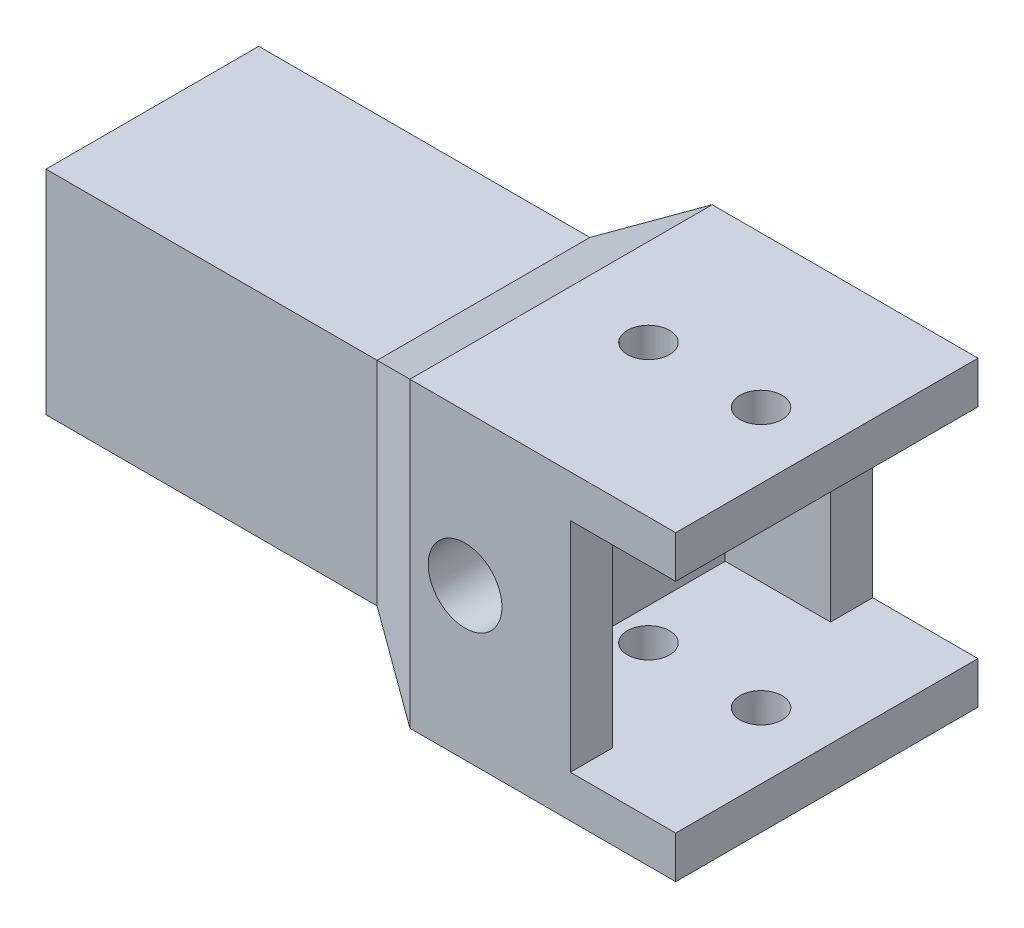
ISO-10303-21;
HEADER;
FILE_DESCRIPTION(('STEP AP214'),'2;1');
FILE_NAME('part.step','',(''),(''),'','','');
FILE_SCHEMA(('AUTOMOTIVE_DESIGN { 1 0 10303 214 1 1 1 1 }'));
ENDSEC;
DATA;
#1=APPLICATION_CONTEXT('core data for automotive mechanical design processes');
#2=APPLICATION_PROTOCOL_DEFINITION('international standard','automotive_design',2000,#1);
#3=PRODUCT_CONTEXT('',#1,'mechanical');
#4=PRODUCT('Part','Part','',(#3));
#5=PRODUCT_RELATED_PRODUCT_CATEGORY('part','',(#4));
#6=PRODUCT_DEFINITION_FORMATION('','',#4);
#7=PRODUCT_DEFINITION_CONTEXT('part definition',#1,'design');
#8=PRODUCT_DEFINITION('design','',#6,#7);
#9=PRODUCT_DEFINITION_SHAPE('','',#8);
#10=(LENGTH_UNIT() NAMED_UNIT(*) SI_UNIT(.MILLI.,.METRE.));
#11=(NAMED_UNIT(*) PLANE_ANGLE_UNIT() SI_UNIT($,.RADIAN.));
#12=(NAMED_UNIT(*) SI_UNIT($,.STERADIAN.) SOLID_ANGLE_UNIT());
#13=UNCERTAINTY_MEASURE_WITH_UNIT(LENGTH_MEASURE(1.E-05),#10,'distance_accuracy_value','');
#14=(GEOMETRIC_REPRESENTATION_CONTEXT(3) GLOBAL_UNCERTAINTY_ASSIGNED_CONTEXT((#13)) GLOBAL_UNIT_ASSIGNED_CONTEXT((#10,
#11,#12)) REPRESENTATION_CONTEXT('',''));
#15=CARTESIAN_POINT('',(0.,0.,0.));
#16=DIRECTION('',(0.,0.,1.));
#17=DIRECTION('',(1.,0.,0.));
#18=AXIS2_PLACEMENT_3D('',#15,#16,#17);
#19=CARTESIAN_POINT('',(39.34,0.,0.));
#20=DIRECTION('',(-1.,0.,0.));
#21=DIRECTION('',(0.,0.,1.));
#22=AXIS2_PLACEMENT_3D('',#19,#20,#21);
#23=PLANE('',#22);
#24=DIRECTION('',(0.,0.,-1.));
#25=VECTOR('',#24,1.);
#26=CARTESIAN_POINT('',(39.34,-10.35,-10.35));
#27=LINE('',#26,#25);
#28=CARTESIAN_POINT('',(39.34,-10.35,14.35));
#29=VERTEX_POINT('',#28);
#30=CARTESIAN_POINT('',(39.34,-10.35,-14.35));
#31=VERTEX_POINT('',#30);
#32=EDGE_CURVE('E352',#29,#31,#27,.T.);
#33=ORIENTED_EDGE('',*,*,#32,.F.);
#34=DIRECTION('',(0.,-1.,0.));
#35=VECTOR('',#34,1.);
#36=CARTESIAN_POINT('',(39.34,14.35,14.35));
#37=LINE('',#36,#35);
#38=CARTESIAN_POINT('',(39.34,-14.35,14.35));
#39=VERTEX_POINT('',#38);
#40=EDGE_CURVE('E364',#29,#39,#37,.T.);
#41=ORIENTED_EDGE('',*,*,#40,.T.);
#42=DIRECTION('',(0.,0.,-1.));
#43=VECTOR('',#42,1.);
#44=CARTESIAN_POINT('',(39.34,-14.35,-14.35));
#45=LINE('',#44,#43);
#46=CARTESIAN_POINT('',(39.34,-14.35,-14.35));
#47=VERTEX_POINT('',#46);
#48=EDGE_CURVE('E369',#39,#47,#45,.T.);
#49=ORIENTED_EDGE('',*,*,#48,.T.);
#50=DIRECTION('',(0.,1.,0.));
#51=VECTOR('',#50,1.);
#52=CARTESIAN_POINT('',(39.34,14.35,-14.35));
#53=LINE('',#52,#51);
#54=EDGE_CURVE('E356',#47,#31,#53,.T.);
#55=ORIENTED_EDGE('',*,*,#54,.T.);
#56=EDGE_LOOP('',(#33,#41,#49,#55));
#57=FACE_BOUND('',#56,.T.);
#58=ADVANCED_FACE('F42',(#57),#23,.F.);
#59=CARTESIAN_POINT('',(14.34,-10.35,-10.35));
#60=DIRECTION('',(0.,0.,-1.));
#61=DIRECTION('',(0.,1.,0.));
#62=AXIS2_PLACEMENT_3D('',#59,#60,#61);
#63=PLANE('',#62);
#64=DIRECTION('',(0.,-1.,0.));
#65=VECTOR('',#64,1.);
#66=CARTESIAN_POINT('',(29.34,10.35,-10.35));
#67=LINE('',#66,#65);
#68=CARTESIAN_POINT('',(29.34,10.35,-10.35));
#69=VERTEX_POINT('',#68);
#70=CARTESIAN_POINT('',(29.34,-10.35,-10.35));
#71=VERTEX_POINT('',#70);
#72=EDGE_CURVE('E305',#69,#71,#67,.T.);
#73=ORIENTED_EDGE('',*,*,#72,.F.);
#74=DIRECTION('',(1.,0.,0.));
#75=VECTOR('',#74,1.);
#76=CARTESIAN_POINT('',(14.34,10.35,-10.35));
#77=LINE('',#76,#75);
#78=CARTESIAN_POINT('',(19.34,10.35,-10.35));
#79=VERTEX_POINT('',#78);
#80=EDGE_CURVE('E202',#79,#69,#77,.T.);
#81=ORIENTED_EDGE('',*,*,#80,.F.);
#82=DIRECTION('',(0.,1.,0.));
#83=VECTOR('',#82,1.);
#84=CARTESIAN_POINT('',(19.34,-10.35,-10.35));
#85=LINE('',#84,#83);
#86=CARTESIAN_POINT('',(19.34,3.5,-10.35));
#87=VERTEX_POINT('',#86);
#88=EDGE_CURVE('E376',#87,#79,#85,.T.);
#89=ORIENTED_EDGE('',*,*,#88,.F.);
#90=CARTESIAN_POINT('',(19.34,0.,-10.35));
#91=DIRECTION('',(0.,0.,-1.));
#92=DIRECTION('',(0.,1.,0.));
#93=AXIS2_PLACEMENT_3D('',#90,#91,#92);
#94=CIRCLE('',#93,3.5);
#95=CARTESIAN_POINT('',(19.34,-3.5,-10.35));
#96=VERTEX_POINT('',#95);
#97=EDGE_CURVE('E11',#87,#96,#94,.T.);
#98=ORIENTED_EDGE('',*,*,#97,.T.);
#99=CARTESIAN_POINT('',(19.34,-10.35,-10.35));
#100=VERTEX_POINT('',#99);
#101=EDGE_CURVE('E377',#100,#96,#85,.T.);
#102=ORIENTED_EDGE('',*,*,#101,.F.);
#103=DIRECTION('',(1.,0.,0.));
#104=VECTOR('',#103,1.);
#105=CARTESIAN_POINT('',(14.34,-10.35,-10.35));
#106=LINE('',#105,#104);
#107=EDGE_CURVE('E209',#100,#71,#106,.T.);
#108=ORIENTED_EDGE('',*,*,#107,.T.);
#109=EDGE_LOOP('',(#73,#81,#89,#98,#102,#108));
#110=FACE_BOUND('',#109,.T.);
#111=ADVANCED_FACE('F440',(#110),#63,.F.);
#112=CARTESIAN_POINT('',(19.34,0.,0.));
#113=DIRECTION('',(1.,0.,0.));
#114=DIRECTION('',(0.,0.,-1.));
#115=AXIS2_PLACEMENT_3D('',#112,#113,#114);
#116=PLANE('',#115);
#117=DIRECTION('',(0.,0.,1.));
#118=VECTOR('',#117,1.);
#119=CARTESIAN_POINT('',(19.34,3.5,-14.35));
#120=LINE('',#119,#118);
#121=CARTESIAN_POINT('',(19.34,3.5,10.35));
#122=VERTEX_POINT('',#121);
#123=EDGE_CURVE('E345',#87,#122,#120,.T.);
#124=ORIENTED_EDGE('',*,*,#123,.F.);
#125=ORIENTED_EDGE('',*,*,#88,.T.);
#126=DIRECTION('',(0.,0.,1.));
#127=VECTOR('',#126,1.);
#128=CARTESIAN_POINT('',(19.34,10.35,-10.35));
#129=LINE('',#128,#127);
#130=CARTESIAN_POINT('',(19.34,10.35,10.35));
#131=VERTEX_POINT('',#130);
#132=EDGE_CURVE('E381',#79,#131,#129,.T.);
#133=ORIENTED_EDGE('',*,*,#132,.T.);
#134=DIRECTION('',(0.,-1.,0.));
#135=VECTOR('',#134,1.);
#136=CARTESIAN_POINT('',(19.34,10.35,10.35));
#137=LINE('',#136,#135);
#138=EDGE_CURVE('E199',#131,#122,#137,.T.);
#139=ORIENTED_EDGE('',*,*,#138,.T.);
#140=EDGE_LOOP('',(#124,#125,#133,#139));
#141=FACE_BOUND('',#140,.T.);
#142=ADVANCED_FACE('F447',(#141),#116,.T.);
#143=CARTESIAN_POINT('',(43.8671139599365,10.1,-10.1));
#144=DIRECTION('',(0.,0.,-1.));
#145=DIRECTION('',(0.,1.,0.));
#146=AXIS2_PLACEMENT_3D('',#143,#144,#145);
#147=PLANE('',#146);
#148=DIRECTION('',(-1.,0.,0.));
#149=VECTOR('',#148,1.);
#150=CARTESIAN_POINT('',(43.8671139599365,10.1,-10.1));
#151=LINE('',#150,#149);
#152=CARTESIAN_POINT('',(6.73999999999998,10.1,-10.1));
#153=VERTEX_POINT('',#152);
#154=CARTESIAN_POINT('',(-24.7,10.1,-10.1));
#155=VERTEX_POINT('',#154);
#156=EDGE_CURVE('E409',#153,#155,#151,.T.);
#157=ORIENTED_EDGE('',*,*,#156,.F.);
#158=DIRECTION('',(0.,-1.,0.));
#159=VECTOR('',#158,1.);
#160=CARTESIAN_POINT('',(6.73999999999998,10.1,-10.1));
#161=LINE('',#160,#159);
#162=CARTESIAN_POINT('',(6.73999999999998,-10.1,-10.1));
#163=VERTEX_POINT('',#162);
#164=EDGE_CURVE('E234',#153,#163,#161,.T.);
#165=ORIENTED_EDGE('',*,*,#164,.T.);
#166=DIRECTION('',(-1.,0.,0.));
#167=VECTOR('',#166,1.);
#168=CARTESIAN_POINT('',(43.8671139599365,-10.1,-10.1));
#169=LINE('',#168,#167);
#170=CARTESIAN_POINT('',(-24.7,-10.1,-10.1));
#171=VERTEX_POINT('',#170);
#172=EDGE_CURVE('E406',#163,#171,#169,.T.);
#173=ORIENTED_EDGE('',*,*,#172,.T.);
#174=DIRECTION('',(0.,-1.,0.));
#175=VECTOR('',#174,1.);
#176=CARTESIAN_POINT('',(-24.7,10.1,-10.1));
#177=LINE('',#176,#175);
#178=EDGE_CURVE('E388',#155,#171,#177,.T.);
#179=ORIENTED_EDGE('',*,*,#178,.F.);
#180=EDGE_LOOP('',(#157,#165,#173,#179));
#181=FACE_BOUND('',#180,.T.);
#182=ADVANCED_FACE('F563',(#181),#147,.T.);
#183=CARTESIAN_POINT('',(43.8671139599365,-10.1,10.1));
#184=DIRECTION('',(0.,0.,1.));
#185=DIRECTION('',(0.,-1.,0.));
#186=AXIS2_PLACEMENT_3D('',#183,#184,#185);
#187=PLANE('',#186);
#188=DIRECTION('',(-1.,0.,0.));
#189=VECTOR('',#188,1.);
#190=CARTESIAN_POINT('',(43.8671139599365,-10.1,10.1));
#191=LINE('',#190,#189);
#192=CARTESIAN_POINT('',(6.73999999999998,-10.1,10.1));
#193=VERTEX_POINT('',#192);
#194=CARTESIAN_POINT('',(-24.7,-10.1,10.1));
#195=VERTEX_POINT('',#194);
#196=EDGE_CURVE('E387',#193,#195,#191,.T.);
#197=ORIENTED_EDGE('',*,*,#196,.F.);
#198=DIRECTION('',(0.,1.,0.));
#199=VECTOR('',#198,1.);
#200=CARTESIAN_POINT('',(6.73999999999998,-10.1,10.1));
#201=LINE('',#200,#199);
#202=CARTESIAN_POINT('',(6.73999999999998,10.1,10.1));
#203=VERTEX_POINT('',#202);
#204=EDGE_CURVE('E240',#193,#203,#201,.T.);
#205=ORIENTED_EDGE('',*,*,#204,.T.);
#206=DIRECTION('',(-1.,0.,0.));
#207=VECTOR('',#206,1.);
#208=CARTESIAN_POINT('',(43.8671139599365,10.1,10.1));
#209=LINE('',#208,#207);
#210=CARTESIAN_POINT('',(-24.7,10.1,10.1));
#211=VERTEX_POINT('',#210);
#212=EDGE_CURVE('E405',#203,#211,#209,.T.);
#213=ORIENTED_EDGE('',*,*,#212,.T.);
#214=DIRECTION('',(0.,1.,0.));
#215=VECTOR('',#214,1.);
#216=CARTESIAN_POINT('',(-24.7,-10.1,10.1));
#217=LINE('',#216,#215);
#218=EDGE_CURVE('E397',#195,#211,#217,.T.);
#219=ORIENTED_EDGE('',*,*,#218,.F.);
#220=EDGE_LOOP('',(#197,#205,#213,#219));
#221=FACE_BOUND('',#220,.T.);
#222=ADVANCED_FACE('F570',(#221),#187,.T.);
#223=CARTESIAN_POINT('',(43.8671139599365,-10.1,-10.1));
#224=DIRECTION('',(0.,-1.,0.));
#225=DIRECTION('',(0.,0.,-1.));
#226=AXIS2_PLACEMENT_3D('',#223,#224,#225);
#227=PLANE('',#226);
#228=ORIENTED_EDGE('',*,*,#172,.F.);
#229=DIRECTION('',(0.,0.,1.));
#230=VECTOR('',#229,1.);
#231=CARTESIAN_POINT('',(6.73999999999998,-10.1,-10.1));
#232=LINE('',#231,#230);
#233=EDGE_CURVE('E221',#163,#193,#232,.T.);
#234=ORIENTED_EDGE('',*,*,#233,.T.);
#235=ORIENTED_EDGE('',*,*,#196,.T.);
#236=DIRECTION('',(0.,0.,1.));
#237=VECTOR('',#236,1.);
#238=CARTESIAN_POINT('',(-24.7,-10.1,-10.1));
#239=LINE('',#238,#237);
#240=EDGE_CURVE('E401',#171,#195,#239,.T.);
#241=ORIENTED_EDGE('',*,*,#240,.F.);
#242=EDGE_LOOP('',(#228,#234,#235,#241));
#243=FACE_BOUND('',#242,.T.);
#244=ADVANCED_FACE('F572',(#243),#227,.T.);
#245=CARTESIAN_POINT('',(43.8671139599365,10.1,10.1));
#246=DIRECTION('',(0.,1.,0.));
#247=DIRECTION('',(0.,0.,1.));
#248=AXIS2_PLACEMENT_3D('',#245,#246,#247);
#249=PLANE('',#248);
#250=ORIENTED_EDGE('',*,*,#212,.F.);
#251=DIRECTION('',(0.,0.,-1.));
#252=VECTOR('',#251,1.);
#253=CARTESIAN_POINT('',(6.73999999999998,10.1,10.1));
#254=LINE('',#253,#252);
#255=EDGE_CURVE('E237',#203,#153,#254,.T.);
#256=ORIENTED_EDGE('',*,*,#255,.T.);
#257=ORIENTED_EDGE('',*,*,#156,.T.);
#258=DIRECTION('',(0.,0.,-1.));
#259=VECTOR('',#258,1.);
#260=CARTESIAN_POINT('',(-24.7,10.1,10.1));
#261=LINE('',#260,#259);
#262=EDGE_CURVE('E393',#211,#155,#261,.T.);
#263=ORIENTED_EDGE('',*,*,#262,.F.);
#264=EDGE_LOOP('',(#250,#256,#257,#263));
#265=FACE_BOUND('',#264,.T.);
#266=ADVANCED_FACE('F436',(#265),#249,.T.);
#267=CARTESIAN_POINT('',(-22.7,0.,0.));
#268=DIRECTION('',(-1.,0.,0.));
#269=DIRECTION('',(0.,0.,1.));
#270=AXIS2_PLACEMENT_3D('',#267,#268,#269);
#271=PLANE('',#270);
#272=CARTESIAN_POINT('',(-22.7,0.,0.));
#273=DIRECTION('',(-1.,0.,0.));
#274=DIRECTION('',(0.,0.,1.));
#275=AXIS2_PLACEMENT_3D('',#272,#273,#274);
#276=CIRCLE('',#275,0.0133630953863843);
#277=CARTESIAN_POINT('',(-22.7,0.,0.0133630953863843));
#278=VERTEX_POINT('',#277);
#279=EDGE_CURVE('E216',#278,#278,#276,.T.);
#280=ORIENTED_EDGE('',*,*,#279,.T.);
#281=EDGE_LOOP('',(#280));
#282=FACE_BOUND('',#281,.T.);
#283=ADVANCED_FACE('F422',(#282),#271,.T.);
#284=CARTESIAN_POINT('',(-25.93,0.,0.));
#285=DIRECTION('',(1.,0.,0.));
#286=DIRECTION('',(0.,0.,-1.));
#287=AXIS2_PLACEMENT_3D('',#284,#285,#286);
#288=DEGENERATE_TOROIDAL_SURFACE('',#287,0.0133630953863843,3.23,.T.);
#289=CARTESIAN_POINT('',(-24.7,0.,0.));
#290=DIRECTION('',(-1.,0.,0.));
#291=DIRECTION('',(0.,0.,1.));
#292=AXIS2_PLACEMENT_3D('',#289,#290,#291);
#293=CIRCLE('',#292,3.);
#294=CARTESIAN_POINT('',(-24.7,0.,3.));
#295=VERTEX_POINT('',#294);
#296=EDGE_CURVE('E392',#295,#295,#293,.T.);
#297=ORIENTED_EDGE('',*,*,#296,.T.);
#298=EDGE_LOOP('',(#297));
#299=FACE_BOUND('',#298,.T.);
#300=ORIENTED_EDGE('',*,*,#279,.F.);
#301=EDGE_LOOP('',(#300));
#302=FACE_BOUND('',#301,.T.);
#303=ADVANCED_FACE('F424',(#299,#302),#288,.F.);
#304=CARTESIAN_POINT('',(-24.7,0.,0.));
#305=DIRECTION('',(1.,0.,0.));
#306=DIRECTION('',(0.,0.,-1.));
#307=AXIS2_PLACEMENT_3D('',#304,#305,#306);
#308=PLANE('',#307);
#309=ORIENTED_EDGE('',*,*,#296,.F.);
#310=EDGE_LOOP('',(#309));
#311=FACE_BOUND('',#310,.T.);
#312=ORIENTED_EDGE('',*,*,#240,.T.);
#313=ORIENTED_EDGE('',*,*,#218,.T.);
#314=ORIENTED_EDGE('',*,*,#262,.T.);
#315=ORIENTED_EDGE('',*,*,#178,.T.);
#316=EDGE_LOOP('',(#312,#313,#314,#315));
#317=FACE_BOUND('',#316,.T.);
#318=ADVANCED_FACE('F426',(#311,#317),#308,.F.);
#319=CARTESIAN_POINT('',(14.34,-14.35,14.35));
#320=DIRECTION('',(0.,-1.,0.));
#321=DIRECTION('',(0.,0.,-1.));
#322=AXIS2_PLACEMENT_3D('',#319,#320,#321);
#323=PLANE('',#322);
#324=CARTESIAN_POINT('',(33.09,-14.35,0.));
#325=DIRECTION('',(0.,1.,0.));
#326=DIRECTION('',(0.,0.,1.));
#327=AXIS2_PLACEMENT_3D('',#324,#325,#326);
#328=CIRCLE('',#327,2.);
#329=CARTESIAN_POINT('',(33.09,-14.35,2.));
#330=VERTEX_POINT('',#329);
#331=EDGE_CURVE('E278',#330,#330,#328,.T.);
#332=ORIENTED_EDGE('',*,*,#331,.T.);
#333=EDGE_LOOP('',(#332));
#334=FACE_BOUND('',#333,.T.);
#335=CARTESIAN_POINT('',(22.4012159321676,-14.35,0.));
#336=DIRECTION('',(0.,1.,0.));
#337=DIRECTION('',(0.,0.,1.));
#338=AXIS2_PLACEMENT_3D('',#335,#336,#337);
#339=CIRCLE('',#338,2.);
#340=CARTESIAN_POINT('',(22.4012159321676,-14.35,2.));
#341=VERTEX_POINT('',#340);
#342=EDGE_CURVE('E292',#341,#341,#339,.T.);
#343=ORIENTED_EDGE('',*,*,#342,.T.);
#344=EDGE_LOOP('',(#343));
#345=FACE_BOUND('',#344,.T.);
#346=DIRECTION('',(1.,0.,0.));
#347=VECTOR('',#346,1.);
#348=CARTESIAN_POINT('',(14.34,-14.35,14.35));
#349=LINE('',#348,#347);
#350=CARTESIAN_POINT('',(14.1012159321676,-14.35,14.35));
#351=VERTEX_POINT('',#350);
#352=EDGE_CURVE('E217',#351,#39,#349,.T.);
#353=ORIENTED_EDGE('',*,*,#352,.F.);
#354=DIRECTION('',(0.,0.,-1.));
#355=VECTOR('',#354,1.);
#356=CARTESIAN_POINT('',(14.1012159321676,-14.35,0.));
#357=LINE('',#356,#355);
#358=CARTESIAN_POINT('',(14.1012159321676,-14.35,-14.35));
#359=VERTEX_POINT('',#358);
#360=EDGE_CURVE('E243',#351,#359,#357,.T.);
#361=ORIENTED_EDGE('',*,*,#360,.T.);
#362=DIRECTION('',(1.,0.,0.));
#363=VECTOR('',#362,1.);
#364=CARTESIAN_POINT('',(14.34,-14.35,-14.35));
#365=LINE('',#364,#363);
#366=EDGE_CURVE('E206',#359,#47,#365,.T.);
#367=ORIENTED_EDGE('',*,*,#366,.T.);
#368=ORIENTED_EDGE('',*,*,#48,.F.);
#369=EDGE_LOOP('',(#353,#361,#367,#368));
#370=FACE_BOUND('',#369,.T.);
#371=ADVANCED_FACE('F433',(#334,#345,#370),#323,.T.);
#372=CARTESIAN_POINT('',(14.34,14.35,14.35));
#373=DIRECTION('',(0.,0.,1.));
#374=DIRECTION('',(0.,-1.,0.));
#375=AXIS2_PLACEMENT_3D('',#372,#373,#374);
#376=PLANE('',#375);
#377=DIRECTION('',(1.,0.,0.));
#378=VECTOR('',#377,1.);
#379=CARTESIAN_POINT('',(29.34,-10.35,14.35));
#380=LINE('',#379,#378);
#381=CARTESIAN_POINT('',(29.34,-10.35,14.35));
#382=VERTEX_POINT('',#381);
#383=EDGE_CURVE('E311',#382,#29,#380,.T.);
#384=ORIENTED_EDGE('',*,*,#383,.F.);
#385=DIRECTION('',(0.,-1.,0.));
#386=VECTOR('',#385,1.);
#387=CARTESIAN_POINT('',(29.34,10.35,14.35));
#388=LINE('',#387,#386);
#389=CARTESIAN_POINT('',(29.34,10.35,14.35));
#390=VERTEX_POINT('',#389);
#391=EDGE_CURVE('E182',#390,#382,#388,.T.);
#392=ORIENTED_EDGE('',*,*,#391,.F.);
#393=DIRECTION('',(1.,0.,0.));
#394=VECTOR('',#393,1.);
#395=CARTESIAN_POINT('',(29.34,10.35,14.35));
#396=LINE('',#395,#394);
#397=CARTESIAN_POINT('',(39.34,10.35,14.35));
#398=VERTEX_POINT('',#397);
#399=EDGE_CURVE('E178',#390,#398,#396,.T.);
#400=ORIENTED_EDGE('',*,*,#399,.T.);
#401=CARTESIAN_POINT('',(39.34,14.35,14.35));
#402=VERTEX_POINT('',#401);
#403=EDGE_CURVE('E365',#402,#398,#37,.T.);
#404=ORIENTED_EDGE('',*,*,#403,.F.);
#405=DIRECTION('',(1.,0.,0.));
#406=VECTOR('',#405,1.);
#407=CARTESIAN_POINT('',(14.34,14.35,14.35));
#408=LINE('',#407,#406);
#409=CARTESIAN_POINT('',(14.1012159321676,14.35,14.35));
#410=VERTEX_POINT('',#409);
#411=EDGE_CURVE('E222',#410,#402,#408,.T.);
#412=ORIENTED_EDGE('',*,*,#411,.F.);
#413=DIRECTION('',(0.,-1.,0.));
#414=VECTOR('',#413,1.);
#415=CARTESIAN_POINT('',(14.1012159321676,0.,14.35));
#416=LINE('',#415,#414);
#417=EDGE_CURVE('E53',#410,#351,#416,.T.);
#418=ORIENTED_EDGE('',*,*,#417,.T.);
#419=ORIENTED_EDGE('',*,*,#352,.T.);
#420=ORIENTED_EDGE('',*,*,#40,.F.);
#421=EDGE_LOOP('',(#384,#392,#400,#404,#412,#418,#419,#420));
#422=FACE_BOUND('',#421,.T.);
#423=CARTESIAN_POINT('',(19.34,0.,14.35));
#424=DIRECTION('',(0.,0.,1.));
#425=DIRECTION('',(1.,0.,0.));
#426=AXIS2_PLACEMENT_3D('',#423,#424,#425);
#427=CIRCLE('',#426,3.5);
#428=CARTESIAN_POINT('',(22.84,0.,14.35));
#429=VERTEX_POINT('',#428);
#430=EDGE_CURVE('E315',#429,#429,#427,.T.);
#431=ORIENTED_EDGE('',*,*,#430,.F.);
#432=EDGE_LOOP('',(#431));
#433=FACE_BOUND('',#432,.T.);
#434=ADVANCED_FACE('F468',(#422,#433),#376,.T.);
#435=CARTESIAN_POINT('',(14.34,14.35,-14.35));
#436=DIRECTION('',(0.,1.,0.));
#437=DIRECTION('',(0.,0.,1.));
#438=AXIS2_PLACEMENT_3D('',#435,#436,#437);
#439=PLANE('',#438);
#440=CARTESIAN_POINT('',(33.09,14.35,0.));
#441=DIRECTION('',(0.,1.,0.));
#442=DIRECTION('',(0.,0.,1.));
#443=AXIS2_PLACEMENT_3D('',#440,#441,#442);
#444=CIRCLE('',#443,2.);
#445=CARTESIAN_POINT('',(33.09,14.35,2.));
#446=VERTEX_POINT('',#445);
#447=EDGE_CURVE('E286',#446,#446,#444,.T.);
#448=ORIENTED_EDGE('',*,*,#447,.F.);
#449=EDGE_LOOP('',(#448));
#450=FACE_BOUND('',#449,.T.);
#451=CARTESIAN_POINT('',(22.4012159321676,14.35,0.));
#452=DIRECTION('',(0.,1.,0.));
#453=DIRECTION('',(0.,0.,1.));
#454=AXIS2_PLACEMENT_3D('',#451,#452,#453);
#455=CIRCLE('',#454,2.);
#456=CARTESIAN_POINT('',(22.4012159321676,14.35,2.));
#457=VERTEX_POINT('',#456);
#458=EDGE_CURVE('E298',#457,#457,#455,.T.);
#459=ORIENTED_EDGE('',*,*,#458,.F.);
#460=EDGE_LOOP('',(#459));
#461=FACE_BOUND('',#460,.T.);
#462=ORIENTED_EDGE('',*,*,#411,.T.);
#463=DIRECTION('',(0.,0.,1.));
#464=VECTOR('',#463,1.);
#465=CARTESIAN_POINT('',(39.34,14.35,-14.35));
#466=LINE('',#465,#464);
#467=CARTESIAN_POINT('',(39.34,14.35,-14.35));
#468=VERTEX_POINT('',#467);
#469=EDGE_CURVE('E360',#468,#402,#466,.T.);
#470=ORIENTED_EDGE('',*,*,#469,.F.);
#471=DIRECTION('',(1.,0.,0.));
#472=VECTOR('',#471,1.);
#473=CARTESIAN_POINT('',(14.34,14.35,-14.35));
#474=LINE('',#473,#472);
#475=CARTESIAN_POINT('',(14.1012159321676,14.35,-14.35));
#476=VERTEX_POINT('',#475);
#477=EDGE_CURVE('E225',#476,#468,#474,.T.);
#478=ORIENTED_EDGE('',*,*,#477,.F.);
#479=DIRECTION('',(0.,0.,1.));
#480=VECTOR('',#479,1.);
#481=CARTESIAN_POINT('',(14.1012159321676,14.35,0.));
#482=LINE('',#481,#480);
#483=EDGE_CURVE('E251',#476,#410,#482,.T.);
#484=ORIENTED_EDGE('',*,*,#483,.T.);
#485=EDGE_LOOP('',(#462,#470,#478,#484));
#486=FACE_BOUND('',#485,.T.);
#487=ADVANCED_FACE('F461',(#450,#461,#486),#439,.T.);
#488=CARTESIAN_POINT('',(14.34,-14.35,-14.35));
#489=DIRECTION('',(0.,0.,-1.));
#490=DIRECTION('',(0.,1.,0.));
#491=AXIS2_PLACEMENT_3D('',#488,#489,#490);
#492=PLANE('',#491);
#493=DIRECTION('',(1.,0.,0.));
#494=VECTOR('',#493,1.);
#495=CARTESIAN_POINT('',(29.34,10.35,-14.35));
#496=LINE('',#495,#494);
#497=CARTESIAN_POINT('',(29.34,10.35,-14.35));
#498=VERTEX_POINT('',#497);
#499=CARTESIAN_POINT('',(39.34,10.35,-14.35));
#500=VERTEX_POINT('',#499);
#501=EDGE_CURVE('E193',#498,#500,#496,.T.);
#502=ORIENTED_EDGE('',*,*,#501,.F.);
#503=DIRECTION('',(0.,1.,0.));
#504=VECTOR('',#503,1.);
#505=CARTESIAN_POINT('',(29.34,10.35,-14.35));
#506=LINE('',#505,#504);
#507=CARTESIAN_POINT('',(29.34,-10.35,-14.35));
#508=VERTEX_POINT('',#507);
#509=EDGE_CURVE('E324',#508,#498,#506,.T.);
#510=ORIENTED_EDGE('',*,*,#509,.F.);
#511=DIRECTION('',(1.,0.,0.));
#512=VECTOR('',#511,1.);
#513=CARTESIAN_POINT('',(29.34,-10.35,-14.35));
#514=LINE('',#513,#512);
#515=EDGE_CURVE('E329',#508,#31,#514,.T.);
#516=ORIENTED_EDGE('',*,*,#515,.T.);
#517=ORIENTED_EDGE('',*,*,#54,.F.);
#518=ORIENTED_EDGE('',*,*,#366,.F.);
#519=DIRECTION('',(0.,1.,0.));
#520=VECTOR('',#519,1.);
#521=CARTESIAN_POINT('',(14.1012159321676,0.,-14.35));
#522=LINE('',#521,#520);
#523=EDGE_CURVE('E247',#359,#476,#522,.T.);
#524=ORIENTED_EDGE('',*,*,#523,.T.);
#525=ORIENTED_EDGE('',*,*,#477,.T.);
#526=EDGE_CURVE('E355',#500,#468,#53,.T.);
#527=ORIENTED_EDGE('',*,*,#526,.F.);
#528=EDGE_LOOP('',(#502,#510,#516,#517,#518,#524,#525,#527));
#529=FACE_BOUND('',#528,.T.);
#530=CARTESIAN_POINT('',(19.34,0.,-14.35));
#531=DIRECTION('',(0.,0.,1.));
#532=DIRECTION('',(1.,0.,0.));
#533=AXIS2_PLACEMENT_3D('',#530,#531,#532);
#534=CIRCLE('',#533,3.5);
#535=CARTESIAN_POINT('',(22.84,0.,-14.35));
#536=VERTEX_POINT('',#535);
#537=EDGE_CURVE('E336',#536,#536,#534,.T.);
#538=ORIENTED_EDGE('',*,*,#537,.T.);
#539=EDGE_LOOP('',(#538));
#540=FACE_BOUND('',#539,.T.);
#541=ADVANCED_FACE('F454',(#529,#540),#492,.T.);
#542=ORIENTED_EDGE('',*,*,#403,.T.);
#543=DIRECTION('',(0.,0.,1.));
#544=VECTOR('',#543,1.);
#545=CARTESIAN_POINT('',(39.34,10.35,-10.35));
#546=LINE('',#545,#544);
#547=EDGE_CURVE('E273',#500,#398,#546,.T.);
#548=ORIENTED_EDGE('',*,*,#547,.F.);
#549=ORIENTED_EDGE('',*,*,#526,.T.);
#550=ORIENTED_EDGE('',*,*,#469,.T.);
#551=EDGE_LOOP('',(#542,#548,#549,#550));
#552=FACE_BOUND('',#551,.T.);
#553=ADVANCED_FACE('F443',(#552),#23,.F.);
#554=DIRECTION('',(0.,0.,1.));
#555=VECTOR('',#554,1.);
#556=CARTESIAN_POINT('',(19.34,-3.5,-14.35));
#557=LINE('',#556,#555);
#558=CARTESIAN_POINT('',(19.34,-3.5,10.35));
#559=VERTEX_POINT('',#558);
#560=EDGE_CURVE('E69',#559,#96,#557,.F.);
#561=ORIENTED_EDGE('',*,*,#560,.F.);
#562=CARTESIAN_POINT('',(19.34,-10.35,10.35));
#563=VERTEX_POINT('',#562);
#564=EDGE_CURVE('E384',#559,#563,#137,.T.);
#565=ORIENTED_EDGE('',*,*,#564,.T.);
#566=DIRECTION('',(0.,0.,-1.));
#567=VECTOR('',#566,1.);
#568=CARTESIAN_POINT('',(19.34,-10.35,10.35));
#569=LINE('',#568,#567);
#570=EDGE_CURVE('E373',#563,#100,#569,.T.);
#571=ORIENTED_EDGE('',*,*,#570,.T.);
#572=ORIENTED_EDGE('',*,*,#101,.T.);
#573=EDGE_LOOP('',(#561,#565,#571,#572));
#574=FACE_BOUND('',#573,.T.);
#575=ADVANCED_FACE('F453',(#574),#116,.T.);
#576=CARTESIAN_POINT('',(14.34,10.35,-10.35));
#577=DIRECTION('',(0.,1.,0.));
#578=DIRECTION('',(0.,0.,1.));
#579=AXIS2_PLACEMENT_3D('',#576,#577,#578);
#580=PLANE('',#579);
#581=CARTESIAN_POINT('',(33.09,10.35,0.));
#582=DIRECTION('',(0.,1.,0.));
#583=DIRECTION('',(0.,0.,1.));
#584=AXIS2_PLACEMENT_3D('',#581,#582,#583);
#585=CIRCLE('',#584,2.);
#586=CARTESIAN_POINT('',(33.09,10.35,2.));
#587=VERTEX_POINT('',#586);
#588=EDGE_CURVE('E302',#587,#587,#585,.T.);
#589=ORIENTED_EDGE('',*,*,#588,.T.);
#590=EDGE_LOOP('',(#589));
#591=FACE_BOUND('',#590,.T.);
#592=CARTESIAN_POINT('',(22.4012159321676,10.35,0.));
#593=DIRECTION('',(0.,1.,0.));
#594=DIRECTION('',(0.,0.,1.));
#595=AXIS2_PLACEMENT_3D('',#592,#593,#594);
#596=CIRCLE('',#595,2.);
#597=CARTESIAN_POINT('',(22.4012159321676,10.35,2.));
#598=VERTEX_POINT('',#597);
#599=EDGE_CURVE('E277',#598,#598,#596,.T.);
#600=ORIENTED_EDGE('',*,*,#599,.T.);
#601=EDGE_LOOP('',(#600));
#602=FACE_BOUND('',#601,.T.);
#603=DIRECTION('',(1.,0.,0.));
#604=VECTOR('',#603,1.);
#605=CARTESIAN_POINT('',(14.34,10.35,10.35));
#606=LINE('',#605,#604);
#607=CARTESIAN_POINT('',(29.34,10.35,10.35));
#608=VERTEX_POINT('',#607);
#609=EDGE_CURVE('E176',#131,#608,#606,.T.);
#610=ORIENTED_EDGE('',*,*,#609,.F.);
#611=ORIENTED_EDGE('',*,*,#132,.F.);
#612=ORIENTED_EDGE('',*,*,#80,.T.);
#613=DIRECTION('',(0.,0.,1.));
#614=VECTOR('',#613,1.);
#615=CARTESIAN_POINT('',(29.34,10.35,-10.35));
#616=LINE('',#615,#614);
#617=EDGE_CURVE('E61',#498,#69,#616,.T.);
#618=ORIENTED_EDGE('',*,*,#617,.F.);
#619=ORIENTED_EDGE('',*,*,#501,.T.);
#620=ORIENTED_EDGE('',*,*,#547,.T.);
#621=ORIENTED_EDGE('',*,*,#399,.F.);
#622=DIRECTION('',(0.,0.,1.));
#623=VECTOR('',#622,1.);
#624=CARTESIAN_POINT('',(29.34,10.35,10.35));
#625=LINE('',#624,#623);
#626=EDGE_CURVE('E171',#608,#390,#625,.T.);
#627=ORIENTED_EDGE('',*,*,#626,.F.);
#628=EDGE_LOOP('',(#610,#611,#612,#618,#619,#620,#621,#627));
#629=FACE_BOUND('',#628,.T.);
#630=ADVANCED_FACE('F173',(#591,#602,#629),#580,.F.);
#631=CARTESIAN_POINT('',(14.34,10.35,10.35));
#632=DIRECTION('',(0.,0.,1.));
#633=DIRECTION('',(0.,-1.,0.));
#634=AXIS2_PLACEMENT_3D('',#631,#632,#633);
#635=PLANE('',#634);
#636=ORIENTED_EDGE('',*,*,#609,.T.);
#637=DIRECTION('',(0.,1.,0.));
#638=VECTOR('',#637,1.);
#639=CARTESIAN_POINT('',(29.34,10.35,10.35));
#640=LINE('',#639,#638);
#641=CARTESIAN_POINT('',(29.34,-10.35,10.35));
#642=VERTEX_POINT('',#641);
#643=EDGE_CURVE('E183',#642,#608,#640,.T.);
#644=ORIENTED_EDGE('',*,*,#643,.F.);
#645=DIRECTION('',(1.,0.,0.));
#646=VECTOR('',#645,1.);
#647=CARTESIAN_POINT('',(14.34,-10.35,10.35));
#648=LINE('',#647,#646);
#649=EDGE_CURVE('E201',#563,#642,#648,.T.);
#650=ORIENTED_EDGE('',*,*,#649,.F.);
#651=ORIENTED_EDGE('',*,*,#564,.F.);
#652=CARTESIAN_POINT('',(19.34,0.,10.35));
#653=DIRECTION('',(0.,0.,1.));
#654=DIRECTION('',(0.,-1.,0.));
#655=AXIS2_PLACEMENT_3D('',#652,#653,#654);
#656=CIRCLE('',#655,3.5);
#657=EDGE_CURVE('E263',#559,#122,#656,.T.);
#658=ORIENTED_EDGE('',*,*,#657,.T.);
#659=ORIENTED_EDGE('',*,*,#138,.F.);
#660=EDGE_LOOP('',(#636,#644,#650,#651,#658,#659));
#661=FACE_BOUND('',#660,.T.);
#662=ADVANCED_FACE('F196',(#661),#635,.F.);
#663=CARTESIAN_POINT('',(14.34,-10.35,10.35));
#664=DIRECTION('',(0.,-1.,0.));
#665=DIRECTION('',(0.,0.,-1.));
#666=AXIS2_PLACEMENT_3D('',#663,#664,#665);
#667=PLANE('',#666);
#668=CARTESIAN_POINT('',(33.09,-10.35,0.));
#669=DIRECTION('',(0.,-1.,0.));
#670=DIRECTION('',(0.,0.,-1.));
#671=AXIS2_PLACEMENT_3D('',#668,#669,#670);
#672=CIRCLE('',#671,2.);
#673=CARTESIAN_POINT('',(33.09,-10.35,-2.));
#674=VERTEX_POINT('',#673);
#675=EDGE_CURVE('E47',#674,#674,#672,.T.);
#676=ORIENTED_EDGE('',*,*,#675,.T.);
#677=EDGE_LOOP('',(#676));
#678=FACE_BOUND('',#677,.T.);
#679=CARTESIAN_POINT('',(22.4012159321676,-10.35,0.));
#680=DIRECTION('',(0.,-1.,0.));
#681=DIRECTION('',(0.,0.,-1.));
#682=AXIS2_PLACEMENT_3D('',#679,#680,#681);
#683=CIRCLE('',#682,2.);
#684=CARTESIAN_POINT('',(22.4012159321676,-10.35,-2.));
#685=VERTEX_POINT('',#684);
#686=EDGE_CURVE('E274',#685,#685,#683,.T.);
#687=ORIENTED_EDGE('',*,*,#686,.T.);
#688=EDGE_LOOP('',(#687));
#689=FACE_BOUND('',#688,.T.);
#690=ORIENTED_EDGE('',*,*,#107,.F.);
#691=ORIENTED_EDGE('',*,*,#570,.F.);
#692=ORIENTED_EDGE('',*,*,#649,.T.);
#693=DIRECTION('',(0.,0.,-1.));
#694=VECTOR('',#693,1.);
#695=CARTESIAN_POINT('',(29.34,-10.35,10.35));
#696=LINE('',#695,#694);
#697=EDGE_CURVE('E188',#382,#642,#696,.T.);
#698=ORIENTED_EDGE('',*,*,#697,.F.);
#699=ORIENTED_EDGE('',*,*,#383,.T.);
#700=ORIENTED_EDGE('',*,*,#32,.T.);
#701=ORIENTED_EDGE('',*,*,#515,.F.);
#702=DIRECTION('',(0.,0.,-1.));
#703=VECTOR('',#702,1.);
#704=CARTESIAN_POINT('',(29.34,-10.35,-10.35));
#705=LINE('',#704,#703);
#706=EDGE_CURVE('E320',#71,#508,#705,.T.);
#707=ORIENTED_EDGE('',*,*,#706,.F.);
#708=EDGE_LOOP('',(#690,#691,#692,#698,#699,#700,#701,#707));
#709=FACE_BOUND('',#708,.T.);
#710=ADVANCED_FACE('F473',(#678,#689,#709),#667,.F.);
#711=CARTESIAN_POINT('',(14.34,14.4878620458412,0.));
#712=DIRECTION('',(0.500000000000006,-0.866025403784435,0.));
#713=DIRECTION('',(0.,0.,1.));
#714=AXIS2_PLACEMENT_3D('',#711,#712,#713);
#715=PLANE('',#714);
#716=DIRECTION('',(0.774596669241479,0.447213595499962,-0.447213595499962));
#717=VECTOR('',#716,1.);
#718=CARTESIAN_POINT('',(9.32125736871083,11.5902896366729,-11.5902896366729));
#719=LINE('',#718,#717);
#720=EDGE_CURVE('E266',#153,#476,#719,.T.);
#721=ORIENTED_EDGE('',*,*,#720,.F.);
#722=ORIENTED_EDGE('',*,*,#255,.F.);
#723=DIRECTION('',(0.774596669241479,0.447213595499962,0.447213595499962));
#724=VECTOR('',#723,1.);
#725=CARTESIAN_POINT('',(9.32125736871083,11.5902896366729,11.5902896366729));
#726=LINE('',#725,#724);
#727=EDGE_CURVE('E270',#410,#203,#726,.F.);
#728=ORIENTED_EDGE('',*,*,#727,.F.);
#729=ORIENTED_EDGE('',*,*,#483,.F.);
#730=EDGE_LOOP('',(#721,#722,#728,#729));
#731=FACE_BOUND('',#730,.T.);
#732=ADVANCED_FACE('F45',(#731),#715,.F.);
#733=CARTESIAN_POINT('',(14.34,0.,14.4878620458412));
#734=DIRECTION('',(0.500000000000006,0.,-0.866025403784435));
#735=DIRECTION('',(0.,-1.,0.));
#736=AXIS2_PLACEMENT_3D('',#733,#734,#735);
#737=PLANE('',#736);
#738=ORIENTED_EDGE('',*,*,#727,.T.);
#739=ORIENTED_EDGE('',*,*,#204,.F.);
#740=DIRECTION('',(-0.774596669241479,0.447213595499962,-0.447213595499962));
#741=VECTOR('',#740,1.);
#742=CARTESIAN_POINT('',(9.32125736871083,-11.5902896366729,11.5902896366729));
#743=LINE('',#742,#741);
#744=EDGE_CURVE('E262',#351,#193,#743,.T.);
#745=ORIENTED_EDGE('',*,*,#744,.F.);
#746=ORIENTED_EDGE('',*,*,#417,.F.);
#747=EDGE_LOOP('',(#738,#739,#745,#746));
#748=FACE_BOUND('',#747,.T.);
#749=ADVANCED_FACE('F539',(#748),#737,.F.);
#750=CARTESIAN_POINT('',(14.34,0.,-14.4878620458412));
#751=DIRECTION('',(0.500000000000006,0.,0.866025403784435));
#752=DIRECTION('',(0.,1.,0.));
#753=AXIS2_PLACEMENT_3D('',#750,#751,#752);
#754=PLANE('',#753);
#755=ORIENTED_EDGE('',*,*,#720,.T.);
#756=ORIENTED_EDGE('',*,*,#523,.F.);
#757=DIRECTION('',(0.774596669241479,-0.447213595499962,-0.447213595499962));
#758=VECTOR('',#757,1.);
#759=CARTESIAN_POINT('',(9.32125736871083,-11.5902896366729,-11.5902896366729));
#760=LINE('',#759,#758);
#761=EDGE_CURVE('E258',#163,#359,#760,.T.);
#762=ORIENTED_EDGE('',*,*,#761,.F.);
#763=ORIENTED_EDGE('',*,*,#164,.F.);
#764=EDGE_LOOP('',(#755,#756,#762,#763));
#765=FACE_BOUND('',#764,.T.);
#766=ADVANCED_FACE('F533',(#765),#754,.F.);
#767=CARTESIAN_POINT('',(14.34,-14.4878620458412,0.));
#768=DIRECTION('',(0.500000000000005,0.866025403784435,0.));
#769=DIRECTION('',(0.,0.,-1.));
#770=AXIS2_PLACEMENT_3D('',#767,#768,#769);
#771=PLANE('',#770);
#772=ORIENTED_EDGE('',*,*,#744,.T.);
#773=ORIENTED_EDGE('',*,*,#233,.F.);
#774=ORIENTED_EDGE('',*,*,#761,.T.);
#775=ORIENTED_EDGE('',*,*,#360,.F.);
#776=EDGE_LOOP('',(#772,#773,#774,#775));
#777=FACE_BOUND('',#776,.T.);
#778=ADVANCED_FACE('F526',(#777),#771,.F.);
#779=CARTESIAN_POINT('',(19.34,0.,-14.35));
#780=DIRECTION('',(0.,0.,1.));
#781=DIRECTION('',(1.,0.,0.));
#782=AXIS2_PLACEMENT_3D('',#779,#780,#781);
#783=CYLINDRICAL_SURFACE('',#782,3.5);
#784=ORIENTED_EDGE('',*,*,#537,.F.);
#785=EDGE_LOOP('',(#784));
#786=FACE_BOUND('',#785,.T.);
#787=ORIENTED_EDGE('',*,*,#430,.T.);
#788=EDGE_LOOP('',(#787));
#789=FACE_BOUND('',#788,.T.);
#790=ORIENTED_EDGE('',*,*,#560,.T.);
#791=ORIENTED_EDGE('',*,*,#97,.F.);
#792=ORIENTED_EDGE('',*,*,#123,.T.);
#793=ORIENTED_EDGE('',*,*,#657,.F.);
#794=EDGE_LOOP('',(#790,#791,#792,#793));
#795=FACE_BOUND('',#794,.T.);
#796=ADVANCED_FACE('F532',(#786,#789,#795),#783,.F.);
#797=CARTESIAN_POINT('',(29.34,0.,0.));
#798=DIRECTION('',(1.,0.,0.));
#799=DIRECTION('',(0.,0.,-1.));
#800=AXIS2_PLACEMENT_3D('',#797,#798,#799);
#801=PLANE('',#800);
#802=ORIENTED_EDGE('',*,*,#72,.T.);
#803=ORIENTED_EDGE('',*,*,#706,.T.);
#804=ORIENTED_EDGE('',*,*,#509,.T.);
#805=ORIENTED_EDGE('',*,*,#617,.T.);
#806=EDGE_LOOP('',(#802,#803,#804,#805));
#807=FACE_BOUND('',#806,.T.);
#808=ADVANCED_FACE('F584',(#807),#801,.T.);
#809=CARTESIAN_POINT('',(29.34,0.,0.));
#810=DIRECTION('',(-1.,0.,0.));
#811=DIRECTION('',(0.,0.,1.));
#812=AXIS2_PLACEMENT_3D('',#809,#810,#811);
#813=PLANE('',#812);
#814=ORIENTED_EDGE('',*,*,#643,.T.);
#815=ORIENTED_EDGE('',*,*,#626,.T.);
#816=ORIENTED_EDGE('',*,*,#391,.T.);
#817=ORIENTED_EDGE('',*,*,#697,.T.);
#818=EDGE_LOOP('',(#814,#815,#816,#817));
#819=FACE_BOUND('',#818,.T.);
#820=ADVANCED_FACE('F186',(#819),#813,.F.);
#821=CARTESIAN_POINT('',(22.4012159321676,-14.35,0.));
#822=DIRECTION('',(0.,1.,0.));
#823=DIRECTION('',(0.,0.,1.));
#824=AXIS2_PLACEMENT_3D('',#821,#822,#823);
#825=CYLINDRICAL_SURFACE('',#824,2.);
#826=ORIENTED_EDGE('',*,*,#342,.F.);
#827=EDGE_LOOP('',(#826));
#828=FACE_BOUND('',#827,.T.);
#829=ORIENTED_EDGE('',*,*,#686,.F.);
#830=EDGE_LOOP('',(#829));
#831=FACE_BOUND('',#830,.T.);
#832=ADVANCED_FACE('F488',(#828,#831),#825,.F.);
#833=CARTESIAN_POINT('',(33.09,-14.35,0.));
#834=DIRECTION('',(0.,1.,0.));
#835=DIRECTION('',(0.,0.,1.));
#836=AXIS2_PLACEMENT_3D('',#833,#834,#835);
#837=CYLINDRICAL_SURFACE('',#836,2.);
#838=ORIENTED_EDGE('',*,*,#331,.F.);
#839=EDGE_LOOP('',(#838));
#840=FACE_BOUND('',#839,.T.);
#841=ORIENTED_EDGE('',*,*,#675,.F.);
#842=EDGE_LOOP('',(#841));
#843=FACE_BOUND('',#842,.T.);
#844=ADVANCED_FACE('F485',(#840,#843),#837,.F.);
#845=ORIENTED_EDGE('',*,*,#458,.T.);
#846=EDGE_LOOP('',(#845));
#847=FACE_BOUND('',#846,.T.);
#848=ORIENTED_EDGE('',*,*,#599,.F.);
#849=EDGE_LOOP('',(#848));
#850=FACE_BOUND('',#849,.T.);
#851=ADVANCED_FACE('F487',(#847,#850),#825,.F.);
#852=ORIENTED_EDGE('',*,*,#447,.T.);
#853=EDGE_LOOP('',(#852));
#854=FACE_BOUND('',#853,.T.);
#855=ORIENTED_EDGE('',*,*,#588,.F.);
#856=EDGE_LOOP('',(#855));
#857=FACE_BOUND('',#856,.T.);
#858=ADVANCED_FACE('F491',(#854,#857),#837,.F.);
#859=CLOSED_SHELL('',(#58,#111,#142,#182,#222,#244,#266,#283,#303,#318,#371,#434,#487,#541,#553,
#575,#630,#662,#710,#732,#749,#766,#778,#796,#808,#820,#832,#844,#851,#858));
#860=MANIFOLD_SOLID_BREP('B2',#859);
#861=ADVANCED_BREP_SHAPE_REPRESENTATION('',(#18,#860),#14);
#862=SHAPE_DEFINITION_REPRESENTATION(#9,#861);
ENDSEC;
END-ISO-10303-21;
